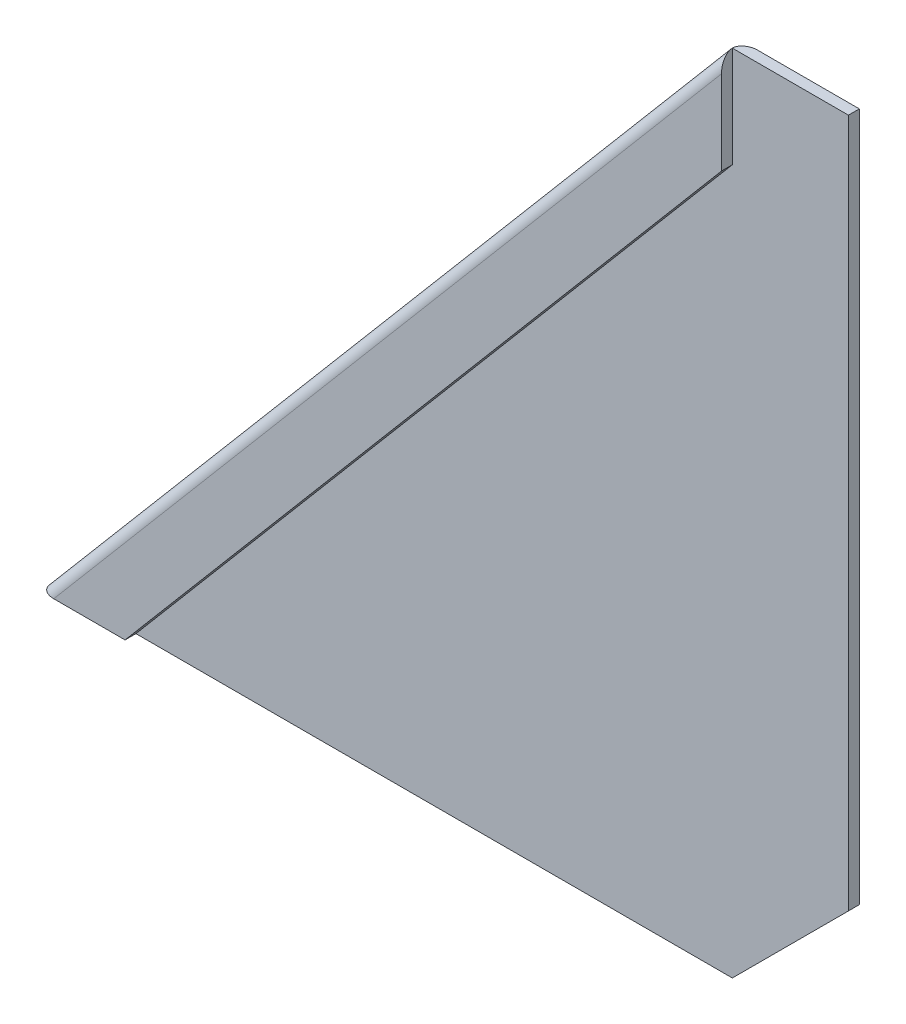
ISO-10303-21;
HEADER;
FILE_DESCRIPTION(('STEP AP214'),'2;1');
FILE_NAME('part.step','',(''),(''),'','','');
FILE_SCHEMA(('AUTOMOTIVE_DESIGN { 1 0 10303 214 1 1 1 1 }'));
ENDSEC;
DATA;
#1=APPLICATION_CONTEXT('core data for automotive mechanical design processes');
#2=APPLICATION_PROTOCOL_DEFINITION('international standard','automotive_design',2000,#1);
#3=PRODUCT_CONTEXT('',#1,'mechanical');
#4=PRODUCT('Part','Part','',(#3));
#5=PRODUCT_RELATED_PRODUCT_CATEGORY('part','',(#4));
#6=PRODUCT_DEFINITION_FORMATION('','',#4);
#7=PRODUCT_DEFINITION_CONTEXT('part definition',#1,'design');
#8=PRODUCT_DEFINITION('design','',#6,#7);
#9=PRODUCT_DEFINITION_SHAPE('','',#8);
#10=(LENGTH_UNIT() NAMED_UNIT(*) SI_UNIT(.MILLI.,.METRE.));
#11=(NAMED_UNIT(*) PLANE_ANGLE_UNIT() SI_UNIT($,.RADIAN.));
#12=(NAMED_UNIT(*) SI_UNIT($,.STERADIAN.) SOLID_ANGLE_UNIT());
#13=UNCERTAINTY_MEASURE_WITH_UNIT(LENGTH_MEASURE(1.E-05),#10,'distance_accuracy_value','');
#14=(GEOMETRIC_REPRESENTATION_CONTEXT(3) GLOBAL_UNCERTAINTY_ASSIGNED_CONTEXT((#13)) GLOBAL_UNIT_ASSIGNED_CONTEXT((#10,
#11,#12)) REPRESENTATION_CONTEXT('',''));
#15=CARTESIAN_POINT('',(0.,0.,0.));
#16=DIRECTION('',(0.,0.,1.));
#17=DIRECTION('',(1.,0.,0.));
#18=AXIS2_PLACEMENT_3D('',#15,#16,#17);
#19=CARTESIAN_POINT('',(-98.2063951167096,0.,1.5));
#20=DIRECTION('',(0.,1.,0.));
#21=DIRECTION('',(0.,0.,1.));
#22=AXIS2_PLACEMENT_3D('',#19,#20,#21);
#23=PLANE('',#22);
#24=CARTESIAN_POINT('',(-108.034399186118,0.,1.5));
#25=DIRECTION('',(0.,1.,0.));
#26=DIRECTION('',(1.,0.,0.));
#27=AXIS2_PLACEMENT_3D('',#24,#25,#26);
#28=ELLIPSE('',#27,1.96560081388173,1.5);
#29=CARTESIAN_POINT('',(-108.034399186118,0.,3.));
#30=VERTEX_POINT('',#29);
#31=CARTESIAN_POINT('',(-110.,0.,1.5));
#32=VERTEX_POINT('',#31);
#33=EDGE_CURVE('E156',#30,#32,#28,.F.);
#34=ORIENTED_EDGE('',*,*,#33,.T.);
#35=CARTESIAN_POINT('',(-108.034399186118,0.,1.5));
#36=DIRECTION('',(0.,1.,0.));
#37=DIRECTION('',(-1.,0.,0.));
#38=AXIS2_PLACEMENT_3D('',#35,#36,#37);
#39=ELLIPSE('',#38,1.96560081388173,1.5);
#40=CARTESIAN_POINT('',(-108.034399186118,0.,0.));
#41=VERTEX_POINT('',#40);
#42=EDGE_CURVE('E158',#32,#41,#39,.F.);
#43=ORIENTED_EDGE('',*,*,#42,.T.);
#44=DIRECTION('',(1.,0.,0.));
#45=VECTOR('',#44,1.);
#46=CARTESIAN_POINT('',(-98.2063951167096,0.,0.));
#47=LINE('',#46,#45);
#48=CARTESIAN_POINT('',(-16.,0.,0.));
#49=VERTEX_POINT('',#48);
#50=EDGE_CURVE('E117',#41,#49,#47,.T.);
#51=ORIENTED_EDGE('',*,*,#50,.T.);
#52=DIRECTION('',(0.,0.,-1.));
#53=VECTOR('',#52,1.);
#54=CARTESIAN_POINT('',(-16.,0.,1.5));
#55=LINE('',#54,#53);
#56=CARTESIAN_POINT('',(-16.,0.,1.5));
#57=VERTEX_POINT('',#56);
#58=EDGE_CURVE('E153',#57,#49,#55,.T.);
#59=ORIENTED_EDGE('',*,*,#58,.F.);
#60=DIRECTION('',(1.,0.,0.));
#61=VECTOR('',#60,1.);
#62=CARTESIAN_POINT('',(-98.2063951167096,0.,1.5));
#63=LINE('',#62,#61);
#64=CARTESIAN_POINT('',(-98.2063951167096,0.,1.5));
#65=VERTEX_POINT('',#64);
#66=EDGE_CURVE('E114',#65,#57,#63,.T.);
#67=ORIENTED_EDGE('',*,*,#66,.F.);
#68=DIRECTION('',(0.,0.,-1.));
#69=VECTOR('',#68,1.);
#70=CARTESIAN_POINT('',(-98.2063951167096,0.,3.));
#71=LINE('',#70,#69);
#72=CARTESIAN_POINT('',(-98.2063951167096,0.,3.));
#73=VERTEX_POINT('',#72);
#74=EDGE_CURVE('E111',#73,#65,#71,.T.);
#75=ORIENTED_EDGE('',*,*,#74,.F.);
#76=DIRECTION('',(1.,0.,0.));
#77=VECTOR('',#76,1.);
#78=CARTESIAN_POINT('',(-110.,0.,3.));
#79=LINE('',#78,#77);
#80=EDGE_CURVE('E99',#30,#73,#79,.T.);
#81=ORIENTED_EDGE('',*,*,#80,.F.);
#82=EDGE_LOOP('',(#34,#43,#51,#59,#67,#75,#81));
#83=FACE_BOUND('',#82,.T.);
#84=ADVANCED_FACE('F33',(#83),#23,.F.);
#85=CARTESIAN_POINT('',(-16.,0.,1.5));
#86=DIRECTION('',(-0.707106781186547,0.707106781186547,0.));
#87=DIRECTION('',(-0.707106781186548,-0.707106781186548,0.));
#88=AXIS2_PLACEMENT_3D('',#85,#86,#87);
#89=PLANE('',#88);
#90=DIRECTION('',(0.707106781186548,0.707106781186548,0.));
#91=VECTOR('',#90,1.);
#92=CARTESIAN_POINT('',(-16.,0.,0.));
#93=LINE('',#92,#91);
#94=CARTESIAN_POINT('',(0.,16.,0.));
#95=VERTEX_POINT('',#94);
#96=EDGE_CURVE('E142',#49,#95,#93,.T.);
#97=ORIENTED_EDGE('',*,*,#96,.T.);
#98=DIRECTION('',(0.,0.,-1.));
#99=VECTOR('',#98,1.);
#100=CARTESIAN_POINT('',(0.,16.,1.5));
#101=LINE('',#100,#99);
#102=CARTESIAN_POINT('',(0.,16.,1.5));
#103=VERTEX_POINT('',#102);
#104=EDGE_CURVE('E150',#103,#95,#101,.T.);
#105=ORIENTED_EDGE('',*,*,#104,.F.);
#106=DIRECTION('',(0.707106781186548,0.707106781186548,0.));
#107=VECTOR('',#106,1.);
#108=CARTESIAN_POINT('',(-16.,0.,1.5));
#109=LINE('',#108,#107);
#110=EDGE_CURVE('E128',#57,#103,#109,.T.);
#111=ORIENTED_EDGE('',*,*,#110,.F.);
#112=ORIENTED_EDGE('',*,*,#58,.T.);
#113=EDGE_LOOP('',(#97,#105,#111,#112));
#114=FACE_BOUND('',#113,.T.);
#115=ADVANCED_FACE('F183',(#114),#89,.F.);
#116=CARTESIAN_POINT('',(0.,16.,1.5));
#117=DIRECTION('',(-1.,0.,0.));
#118=DIRECTION('',(0.,0.,1.));
#119=AXIS2_PLACEMENT_3D('',#116,#117,#118);
#120=PLANE('',#119);
#121=DIRECTION('',(0.,1.,0.));
#122=VECTOR('',#121,1.);
#123=CARTESIAN_POINT('',(0.,16.,0.));
#124=LINE('',#123,#122);
#125=CARTESIAN_POINT('',(0.,111.,0.));
#126=VERTEX_POINT('',#125);
#127=EDGE_CURVE('E144',#95,#126,#124,.T.);
#128=ORIENTED_EDGE('',*,*,#127,.T.);
#129=DIRECTION('',(0.,0.,-1.));
#130=VECTOR('',#129,1.);
#131=CARTESIAN_POINT('',(0.,111.,1.5));
#132=LINE('',#131,#130);
#133=CARTESIAN_POINT('',(0.,111.,1.5));
#134=VERTEX_POINT('',#133);
#135=EDGE_CURVE('E140',#134,#126,#132,.T.);
#136=ORIENTED_EDGE('',*,*,#135,.F.);
#137=DIRECTION('',(0.,1.,0.));
#138=VECTOR('',#137,1.);
#139=CARTESIAN_POINT('',(0.,16.,1.5));
#140=LINE('',#139,#138);
#141=EDGE_CURVE('E131',#103,#134,#140,.T.);
#142=ORIENTED_EDGE('',*,*,#141,.F.);
#143=ORIENTED_EDGE('',*,*,#104,.T.);
#144=EDGE_LOOP('',(#128,#136,#142,#143));
#145=FACE_BOUND('',#144,.T.);
#146=ADVANCED_FACE('F185',(#145),#120,.F.);
#147=CARTESIAN_POINT('',(0.,111.,1.5));
#148=DIRECTION('',(0.,-1.,0.));
#149=DIRECTION('',(0.,0.,-1.));
#150=AXIS2_PLACEMENT_3D('',#147,#148,#149);
#151=PLANE('',#150);
#152=DIRECTION('',(-1.,0.,0.));
#153=VECTOR('',#152,1.);
#154=CARTESIAN_POINT('',(0.,111.,0.));
#155=LINE('',#154,#153);
#156=CARTESIAN_POINT('',(-14.0343991861183,111.,0.));
#157=VERTEX_POINT('',#156);
#158=EDGE_CURVE('E129',#126,#157,#155,.T.);
#159=ORIENTED_EDGE('',*,*,#158,.T.);
#160=CARTESIAN_POINT('',(-14.0343991861183,111.,1.5));
#161=DIRECTION('',(0.,-1.,0.));
#162=DIRECTION('',(-1.,0.,0.));
#163=AXIS2_PLACEMENT_3D('',#160,#161,#162);
#164=ELLIPSE('',#163,1.96560081388173,1.5);
#165=CARTESIAN_POINT('',(-16.,111.,1.5));
#166=VERTEX_POINT('',#165);
#167=EDGE_CURVE('E55',#157,#166,#164,.F.);
#168=ORIENTED_EDGE('',*,*,#167,.T.);
#169=DIRECTION('',(-1.,0.,0.));
#170=VECTOR('',#169,1.);
#171=CARTESIAN_POINT('',(0.,111.,1.5));
#172=LINE('',#171,#170);
#173=EDGE_CURVE('E133',#134,#166,#172,.T.);
#174=ORIENTED_EDGE('',*,*,#173,.F.);
#175=ORIENTED_EDGE('',*,*,#135,.T.);
#176=EDGE_LOOP('',(#159,#168,#174,#175));
#177=FACE_BOUND('',#176,.T.);
#178=ADVANCED_FACE('F165',(#177),#151,.F.);
#179=CARTESIAN_POINT('',(0.,0.,1.5));
#180=DIRECTION('',(0.,0.,1.));
#181=DIRECTION('',(1.,0.,0.));
#182=AXIS2_PLACEMENT_3D('',#179,#180,#181);
#183=PLANE('',#182);
#184=ORIENTED_EDGE('',*,*,#66,.T.);
#185=ORIENTED_EDGE('',*,*,#110,.T.);
#186=ORIENTED_EDGE('',*,*,#141,.T.);
#187=ORIENTED_EDGE('',*,*,#173,.T.);
#188=DIRECTION('',(0.,-1.,0.));
#189=VECTOR('',#188,1.);
#190=CARTESIAN_POINT('',(-16.,111.,1.5));
#191=LINE('',#190,#189);
#192=CARTESIAN_POINT('',(-16.,97.0735091271785,1.5));
#193=VERTEX_POINT('',#192);
#194=EDGE_CURVE('E136',#166,#193,#191,.T.);
#195=ORIENTED_EDGE('',*,*,#194,.T.);
#196=DIRECTION('',(-0.646250378662442,-0.763125447143948,0.));
#197=VECTOR('',#196,1.);
#198=CARTESIAN_POINT('',(-16.,97.0735091271785,1.5));
#199=LINE('',#198,#197);
#200=EDGE_CURVE('E138',#193,#65,#199,.T.);
#201=ORIENTED_EDGE('',*,*,#200,.T.);
#202=EDGE_LOOP('',(#184,#185,#186,#187,#195,#201));
#203=FACE_BOUND('',#202,.T.);
#204=ADVANCED_FACE('F168',(#203),#183,.T.);
#205=CARTESIAN_POINT('',(0.,0.,0.));
#206=DIRECTION('',(0.,0.,1.));
#207=DIRECTION('',(1.,0.,0.));
#208=AXIS2_PLACEMENT_3D('',#205,#206,#207);
#209=PLANE('',#208);
#210=ORIENTED_EDGE('',*,*,#50,.F.);
#211=DIRECTION('',(-0.646250378662442,-0.763125447143948,0.));
#212=VECTOR('',#211,1.);
#213=CARTESIAN_POINT('',(-62.9149611179356,53.2793364422157,0.));
#214=LINE('',#213,#212);
#215=EDGE_CURVE('E160',#41,#157,#214,.F.);
#216=ORIENTED_EDGE('',*,*,#215,.T.);
#217=ORIENTED_EDGE('',*,*,#158,.F.);
#218=ORIENTED_EDGE('',*,*,#127,.F.);
#219=ORIENTED_EDGE('',*,*,#96,.F.);
#220=EDGE_LOOP('',(#210,#216,#217,#218,#219));
#221=FACE_BOUND('',#220,.T.);
#222=ADVANCED_FACE('F179',(#221),#209,.F.);
#223=CARTESIAN_POINT('',(-98.2063951167096,0.,3.));
#224=DIRECTION('',(-0.763125447143948,0.646250378662442,0.));
#225=DIRECTION('',(-0.646250378662442,-0.763125447143948,0.));
#226=AXIS2_PLACEMENT_3D('',#223,#224,#225);
#227=PLANE('',#226);
#228=ORIENTED_EDGE('',*,*,#200,.F.);
#229=DIRECTION('',(0.,0.,-1.));
#230=VECTOR('',#229,1.);
#231=CARTESIAN_POINT('',(-16.,97.0735091271785,3.));
#232=LINE('',#231,#230);
#233=CARTESIAN_POINT('',(-16.,97.0735091271785,3.));
#234=VERTEX_POINT('',#233);
#235=EDGE_CURVE('E118',#234,#193,#232,.T.);
#236=ORIENTED_EDGE('',*,*,#235,.F.);
#237=DIRECTION('',(0.646250378662442,0.763125447143948,0.));
#238=VECTOR('',#237,1.);
#239=CARTESIAN_POINT('',(-98.2063951167096,0.,3.));
#240=LINE('',#239,#238);
#241=EDGE_CURVE('E103',#73,#234,#240,.T.);
#242=ORIENTED_EDGE('',*,*,#241,.F.);
#243=ORIENTED_EDGE('',*,*,#74,.T.);
#244=EDGE_LOOP('',(#228,#236,#242,#243));
#245=FACE_BOUND('',#244,.T.);
#246=ADVANCED_FACE('F120',(#245),#227,.F.);
#247=CARTESIAN_POINT('',(-16.,97.0735091271785,3.));
#248=DIRECTION('',(-1.,0.,0.));
#249=DIRECTION('',(0.,-1.,0.));
#250=AXIS2_PLACEMENT_3D('',#247,#248,#249);
#251=PLANE('',#250);
#252=ORIENTED_EDGE('',*,*,#194,.F.);
#253=CARTESIAN_POINT('',(-16.,108.678918187863,1.5));
#254=DIRECTION('',(-1.,0.,0.));
#255=DIRECTION('',(0.,1.,0.));
#256=AXIS2_PLACEMENT_3D('',#253,#254,#255);
#257=ELLIPSE('',#256,2.32108181213693,1.5);
#258=CARTESIAN_POINT('',(-16.,108.678918187863,3.));
#259=VERTEX_POINT('',#258);
#260=EDGE_CURVE('E11',#166,#259,#257,.F.);
#261=ORIENTED_EDGE('',*,*,#260,.T.);
#262=DIRECTION('',(0.,1.,0.));
#263=VECTOR('',#262,1.);
#264=CARTESIAN_POINT('',(-16.,97.0735091271785,3.));
#265=LINE('',#264,#263);
#266=EDGE_CURVE('E122',#234,#259,#265,.T.);
#267=ORIENTED_EDGE('',*,*,#266,.F.);
#268=ORIENTED_EDGE('',*,*,#235,.T.);
#269=EDGE_LOOP('',(#252,#261,#267,#268));
#270=FACE_BOUND('',#269,.T.);
#271=ADVANCED_FACE('F171',(#270),#251,.F.);
#272=CARTESIAN_POINT('',(0.,0.,3.));
#273=DIRECTION('',(0.,0.,1.));
#274=DIRECTION('',(1.,0.,0.));
#275=AXIS2_PLACEMENT_3D('',#272,#273,#274);
#276=PLANE('',#275);
#277=ORIENTED_EDGE('',*,*,#266,.T.);
#278=DIRECTION('',(-0.646250378662442,-0.763125447143948,0.));
#279=VECTOR('',#278,1.);
#280=CARTESIAN_POINT('',(-108.855311829284,-0.969375567993674,3.));
#281=LINE('',#280,#279);
#282=EDGE_CURVE('E42',#259,#30,#281,.T.);
#283=ORIENTED_EDGE('',*,*,#282,.T.);
#284=ORIENTED_EDGE('',*,*,#80,.T.);
#285=ORIENTED_EDGE('',*,*,#241,.T.);
#286=EDGE_LOOP('',(#277,#283,#284,#285));
#287=FACE_BOUND('',#286,.T.);
#288=ADVANCED_FACE('F101',(#287),#276,.T.);
#289=CARTESIAN_POINT('',(-62.9149611179356,53.2793364422157,1.5));
#290=DIRECTION('',(0.646250378662442,0.763125447143948,0.));
#291=DIRECTION('',(-0.763125447143948,0.646250378662442,0.));
#292=AXIS2_PLACEMENT_3D('',#289,#290,#291);
#293=CYLINDRICAL_SURFACE('',#292,1.5);
#294=ORIENTED_EDGE('',*,*,#282,.F.);
#295=ORIENTED_EDGE('',*,*,#260,.F.);
#296=DIRECTION('',(-0.646250378662442,-0.763125447143948,0.));
#297=VECTOR('',#296,1.);
#298=CARTESIAN_POINT('',(-16.,111.,1.5));
#299=LINE('',#298,#297);
#300=EDGE_CURVE('E37',#32,#166,#299,.F.);
#301=ORIENTED_EDGE('',*,*,#300,.F.);
#302=ORIENTED_EDGE('',*,*,#33,.F.);
#303=EDGE_LOOP('',(#294,#295,#301,#302));
#304=FACE_BOUND('',#303,.T.);
#305=ADVANCED_FACE('F35',(#304),#293,.T.);
#306=CARTESIAN_POINT('',(-14.8553118292841,110.030624432006,1.5));
#307=DIRECTION('',(-0.646250378662442,-0.763125447143948,0.));
#308=DIRECTION('',(0.763125447143948,-0.646250378662442,0.));
#309=AXIS2_PLACEMENT_3D('',#306,#307,#308);
#310=CYLINDRICAL_SURFACE('',#309,1.5);
#311=ORIENTED_EDGE('',*,*,#167,.F.);
#312=ORIENTED_EDGE('',*,*,#215,.F.);
#313=ORIENTED_EDGE('',*,*,#42,.F.);
#314=ORIENTED_EDGE('',*,*,#300,.T.);
#315=EDGE_LOOP('',(#311,#312,#313,#314));
#316=FACE_BOUND('',#315,.T.);
#317=ADVANCED_FACE('F175',(#316),#310,.T.);
#318=CLOSED_SHELL('',(#84,#115,#146,#178,#204,#222,#246,#271,#288,#305,#317));
#319=MANIFOLD_SOLID_BREP('B2',#318);
#320=ADVANCED_BREP_SHAPE_REPRESENTATION('',(#18,#319),#14);
#321=SHAPE_DEFINITION_REPRESENTATION(#9,#320);
ENDSEC;
END-ISO-10303-21;
